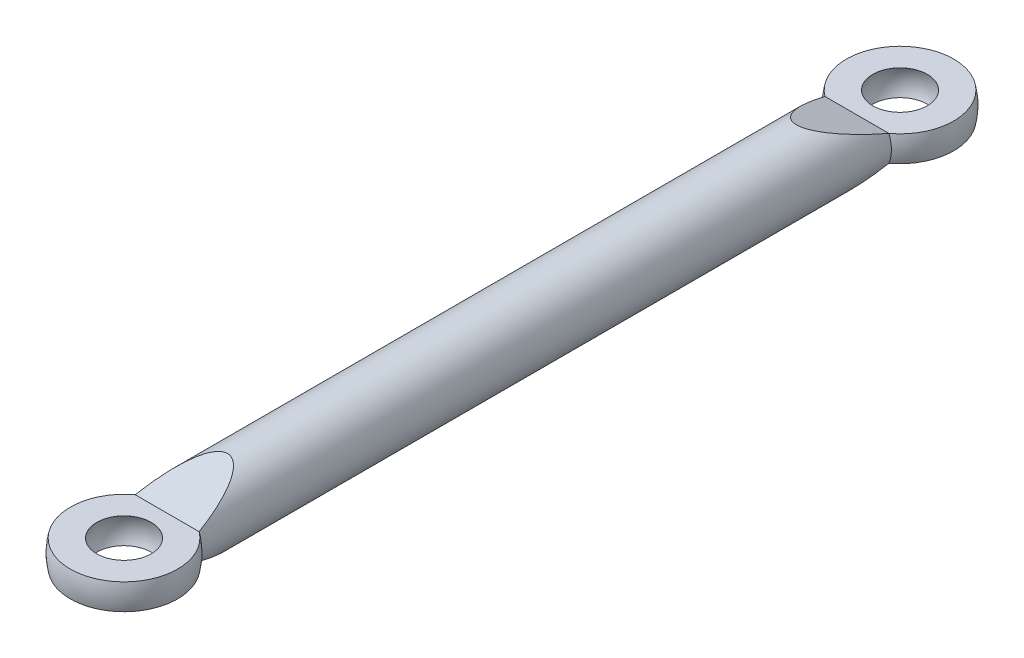
ISO-10303-21;
HEADER;
FILE_DESCRIPTION(('STEP AP214'),'2;1');
FILE_NAME('part.step','',(''),(''),'','','');
FILE_SCHEMA(('AUTOMOTIVE_DESIGN { 1 0 10303 214 1 1 1 1 }'));
ENDSEC;
DATA;
#1=APPLICATION_CONTEXT('core data for automotive mechanical design processes');
#2=APPLICATION_PROTOCOL_DEFINITION('international standard','automotive_design',2000,#1);
#3=PRODUCT_CONTEXT('',#1,'mechanical');
#4=PRODUCT('Part','Part','',(#3));
#5=PRODUCT_RELATED_PRODUCT_CATEGORY('part','',(#4));
#6=PRODUCT_DEFINITION_FORMATION('','',#4);
#7=PRODUCT_DEFINITION_CONTEXT('part definition',#1,'design');
#8=PRODUCT_DEFINITION('design','',#6,#7);
#9=PRODUCT_DEFINITION_SHAPE('','',#8);
#10=(LENGTH_UNIT() NAMED_UNIT(*) SI_UNIT(.MILLI.,.METRE.));
#11=(NAMED_UNIT(*) PLANE_ANGLE_UNIT() SI_UNIT($,.RADIAN.));
#12=(NAMED_UNIT(*) SI_UNIT($,.STERADIAN.) SOLID_ANGLE_UNIT());
#13=UNCERTAINTY_MEASURE_WITH_UNIT(LENGTH_MEASURE(1.E-05),#10,'distance_accuracy_value','');
#14=(GEOMETRIC_REPRESENTATION_CONTEXT(3) GLOBAL_UNCERTAINTY_ASSIGNED_CONTEXT((#13)) GLOBAL_UNIT_ASSIGNED_CONTEXT((#10,
#11,#12)) REPRESENTATION_CONTEXT('',''));
#15=CARTESIAN_POINT('',(0.,0.,0.));
#16=DIRECTION('',(0.,0.,1.));
#17=DIRECTION('',(1.,0.,0.));
#18=AXIS2_PLACEMENT_3D('',#15,#16,#17);
#19=CARTESIAN_POINT('',(0.,0.,40.));
#20=DIRECTION('',(0.,0.,-1.));
#21=DIRECTION('',(-1.,0.,0.));
#22=AXIS2_PLACEMENT_3D('',#19,#20,#21);
#23=CYLINDRICAL_SURFACE('',#22,4.);
#24=CARTESIAN_POINT('',(0.,0.,-40.));
#25=DIRECTION('',(0.,0.,1.));
#26=DIRECTION('',(1.,0.,0.));
#27=AXIS2_PLACEMENT_3D('',#24,#25,#26);
#28=CIRCLE('',#27,4.);
#29=CARTESIAN_POINT('',(-3.70809924354783,-1.5,-40.));
#30=VERTEX_POINT('',#29);
#31=CARTESIAN_POINT('',(-3.70809924354782,1.50000000000001,-40.));
#32=VERTEX_POINT('',#31);
#33=EDGE_CURVE('E83',#30,#32,#28,.F.);
#34=ORIENTED_EDGE('',*,*,#33,.F.);
#35=CARTESIAN_POINT('',(0.,0.,-44.2));
#36=DIRECTION('',(0.,0.941741911594837,0.336336396998157));
#37=DIRECTION('',(0.,0.336336396998157,-0.941741911594837));
#38=AXIS2_PLACEMENT_3D('',#35,#36,#37);
#39=ELLIPSE('',#38,11.8928549978548,4.);
#40=CARTESIAN_POINT('',(3.70809924354783,-1.5,-40.));
#41=VERTEX_POINT('',#40);
#42=EDGE_CURVE('E88',#30,#41,#39,.T.);
#43=ORIENTED_EDGE('',*,*,#42,.T.);
#44=CARTESIAN_POINT('',(3.70809924354783,1.50000000000001,-40.));
#45=VERTEX_POINT('',#44);
#46=EDGE_CURVE('E85',#45,#41,#28,.F.);
#47=ORIENTED_EDGE('',*,*,#46,.F.);
#48=CARTESIAN_POINT('',(0.,0.,-44.2000000000001));
#49=DIRECTION('',(0.,-0.941741911594838,0.336336396998155));
#50=DIRECTION('',(0.,-0.336336396998155,-0.941741911594838));
#51=AXIS2_PLACEMENT_3D('',#48,#49,#50);
#52=ELLIPSE('',#51,11.8928549978548,4.);
#53=EDGE_CURVE('E80',#45,#32,#52,.T.);
#54=ORIENTED_EDGE('',*,*,#53,.T.);
#55=EDGE_LOOP('',(#34,#43,#47,#54));
#56=FACE_BOUND('',#55,.T.);
#57=CARTESIAN_POINT('',(0.,0.,44.2));
#58=DIRECTION('',(0.,0.941741911594837,-0.336336396998156));
#59=DIRECTION('',(0.,-0.336336396998156,-0.941741911594838));
#60=AXIS2_PLACEMENT_3D('',#57,#58,#59);
#61=ELLIPSE('',#60,11.8928549978548,4.);
#62=CARTESIAN_POINT('',(3.70809924354784,-1.50000000000001,40.));
#63=VERTEX_POINT('',#62);
#64=CARTESIAN_POINT('',(-3.70809924354782,-1.50000000000001,40.));
#65=VERTEX_POINT('',#64);
#66=EDGE_CURVE('E89',#63,#65,#61,.T.);
#67=ORIENTED_EDGE('',*,*,#66,.T.);
#68=CARTESIAN_POINT('',(0.,0.,40.));
#69=DIRECTION('',(0.,0.,1.));
#70=DIRECTION('',(1.,0.,0.));
#71=AXIS2_PLACEMENT_3D('',#68,#69,#70);
#72=CIRCLE('',#71,4.);
#73=CARTESIAN_POINT('',(-3.70809924354782,1.5,40.));
#74=VERTEX_POINT('',#73);
#75=EDGE_CURVE('E11',#74,#65,#72,.T.);
#76=ORIENTED_EDGE('',*,*,#75,.F.);
#77=CARTESIAN_POINT('',(0.,0.,44.2));
#78=DIRECTION('',(0.,-0.941741911594837,-0.336336396998156));
#79=DIRECTION('',(0.,0.336336396998156,-0.941741911594837));
#80=AXIS2_PLACEMENT_3D('',#77,#78,#79);
#81=ELLIPSE('',#80,11.8928549978548,4.);
#82=CARTESIAN_POINT('',(3.70809924354784,1.5,40.));
#83=VERTEX_POINT('',#82);
#84=EDGE_CURVE('E103',#74,#83,#81,.T.);
#85=ORIENTED_EDGE('',*,*,#84,.T.);
#86=EDGE_CURVE('E44',#63,#83,#72,.T.);
#87=ORIENTED_EDGE('',*,*,#86,.F.);
#88=EDGE_LOOP('',(#67,#76,#85,#87));
#89=FACE_BOUND('',#88,.T.);
#90=ADVANCED_FACE('F36',(#56,#89),#23,.T.);
#91=CARTESIAN_POINT('',(0.,0.,-45.));
#92=DIRECTION('',(0.,0.,-1.));
#93=DIRECTION('',(-1.,0.,0.));
#94=AXIS2_PLACEMENT_3D('',#91,#92,#93);
#95=SPHERICAL_SURFACE('',#94,6.40312423743285);
#96=ORIENTED_EDGE('',*,*,#46,.T.);
#97=CARTESIAN_POINT('',(0.,-1.5,-45.));
#98=DIRECTION('',(0.,1.,0.));
#99=DIRECTION('',(0.,0.,1.));
#100=AXIS2_PLACEMENT_3D('',#97,#98,#99);
#101=CIRCLE('',#100,6.22494979899436);
#102=EDGE_CURVE('E101',#41,#30,#101,.T.);
#103=ORIENTED_EDGE('',*,*,#102,.T.);
#104=ORIENTED_EDGE('',*,*,#33,.T.);
#105=CARTESIAN_POINT('',(0.,1.50000000000001,-45.));
#106=DIRECTION('',(0.,-1.,0.));
#107=DIRECTION('',(0.,0.,-1.));
#108=AXIS2_PLACEMENT_3D('',#105,#106,#107);
#109=CIRCLE('',#108,6.22494979899436);
#110=EDGE_CURVE('E91',#32,#45,#109,.T.);
#111=ORIENTED_EDGE('',*,*,#110,.T.);
#112=EDGE_LOOP('',(#96,#103,#104,#111));
#113=FACE_BOUND('',#112,.T.);
#114=ADVANCED_FACE('F100',(#113),#95,.T.);
#115=CARTESIAN_POINT('',(0.,0.,45.));
#116=DIRECTION('',(0.,0.,-1.));
#117=DIRECTION('',(-1.,0.,0.));
#118=AXIS2_PLACEMENT_3D('',#115,#116,#117);
#119=SPHERICAL_SURFACE('',#118,6.40312423743285);
#120=CARTESIAN_POINT('',(0.,-1.50000000000001,45.));
#121=DIRECTION('',(0.,1.,0.));
#122=DIRECTION('',(0.,0.,1.));
#123=AXIS2_PLACEMENT_3D('',#120,#121,#122);
#124=CIRCLE('',#123,6.22494979899436);
#125=EDGE_CURVE('E119',#63,#65,#124,.F.);
#126=ORIENTED_EDGE('',*,*,#125,.F.);
#127=ORIENTED_EDGE('',*,*,#86,.T.);
#128=CARTESIAN_POINT('',(0.,1.5,45.));
#129=DIRECTION('',(0.,-1.,0.));
#130=DIRECTION('',(0.,0.,-1.));
#131=AXIS2_PLACEMENT_3D('',#128,#129,#130);
#132=CIRCLE('',#131,6.22494979899436);
#133=EDGE_CURVE('E110',#74,#83,#132,.F.);
#134=ORIENTED_EDGE('',*,*,#133,.F.);
#135=ORIENTED_EDGE('',*,*,#75,.T.);
#136=EDGE_LOOP('',(#126,#127,#134,#135));
#137=FACE_BOUND('',#136,.T.);
#138=ADVANCED_FACE('F137',(#137),#119,.T.);
#139=CARTESIAN_POINT('',(-6.40312423743285,4.,33.));
#140=DIRECTION('',(0.,-0.941741911594837,-0.336336396998156));
#141=DIRECTION('',(0.,0.336336396998156,-0.941741911594837));
#142=AXIS2_PLACEMENT_3D('',#139,#140,#141);
#143=PLANE('',#142);
#144=ORIENTED_EDGE('',*,*,#84,.F.);
#145=DIRECTION('',(1.,0.,0.));
#146=VECTOR('',#145,1.);
#147=CARTESIAN_POINT('',(-6.40312423743285,1.5,40.));
#148=LINE('',#147,#146);
#149=EDGE_CURVE('E111',#74,#83,#148,.T.);
#150=ORIENTED_EDGE('',*,*,#149,.T.);
#151=EDGE_LOOP('',(#144,#150));
#152=FACE_BOUND('',#151,.T.);
#153=ADVANCED_FACE('F134',(#152),#143,.F.);
#154=CARTESIAN_POINT('',(-6.40312423743285,1.5,40.));
#155=DIRECTION('',(0.,-1.,0.));
#156=DIRECTION('',(0.,0.,-1.));
#157=AXIS2_PLACEMENT_3D('',#154,#155,#156);
#158=PLANE('',#157);
#159=ORIENTED_EDGE('',*,*,#133,.T.);
#160=ORIENTED_EDGE('',*,*,#149,.F.);
#161=EDGE_LOOP('',(#159,#160));
#162=FACE_BOUND('',#161,.T.);
#163=CARTESIAN_POINT('',(0.,1.5,45.));
#164=DIRECTION('',(0.,-1.,0.));
#165=DIRECTION('',(0.,0.,-1.));
#166=AXIS2_PLACEMENT_3D('',#163,#164,#165);
#167=CIRCLE('',#166,3.16227766016838);
#168=CARTESIAN_POINT('',(0.,1.5,41.8377223398316));
#169=VERTEX_POINT('',#168);
#170=EDGE_CURVE('E107',#169,#169,#167,.F.);
#171=ORIENTED_EDGE('',*,*,#170,.F.);
#172=EDGE_LOOP('',(#171));
#173=FACE_BOUND('',#172,.T.);
#174=ADVANCED_FACE('F174',(#162,#173),#158,.F.);
#175=CARTESIAN_POINT('',(0.,0.,45.));
#176=DIRECTION('',(0.,0.,-1.));
#177=DIRECTION('',(-1.,0.,0.));
#178=AXIS2_PLACEMENT_3D('',#175,#176,#177);
#179=SPHERICAL_SURFACE('',#178,3.5);
#180=CARTESIAN_POINT('',(0.,0.,45.));
#181=DIRECTION('',(0.,1.,0.));
#182=DIRECTION('',(0.,0.,1.));
#183=AXIS2_PLACEMENT_3D('',#180,#181,#182);
#184=SPHERICAL_SURFACE('',#183,3.5);
#185=CARTESIAN_POINT('',(0.,-1.50000000000001,45.));
#186=DIRECTION('',(0.,1.,0.));
#187=DIRECTION('',(0.,0.,1.));
#188=AXIS2_PLACEMENT_3D('',#185,#186,#187);
#189=CIRCLE('',#188,3.16227766016837);
#190=CARTESIAN_POINT('',(0.,-1.50000000000001,48.1622776601684));
#191=VERTEX_POINT('',#190);
#192=EDGE_CURVE('E39',#191,#191,#189,.F.);
#193=ORIENTED_EDGE('',*,*,#192,.T.);
#194=EDGE_LOOP('',(#193));
#195=FACE_BOUND('',#194,.T.);
#196=ORIENTED_EDGE('',*,*,#170,.T.);
#197=EDGE_LOOP('',(#196));
#198=FACE_BOUND('',#197,.T.);
#199=ADVANCED_FACE('F172',(#195,#198),#184,.F.);
#200=CARTESIAN_POINT('',(-6.40312423743285,4.,-33.));
#201=DIRECTION('',(0.,-0.941741911594838,0.336336396998155));
#202=DIRECTION('',(0.,-0.336336396998155,-0.941741911594838));
#203=AXIS2_PLACEMENT_3D('',#200,#201,#202);
#204=PLANE('',#203);
#205=DIRECTION('',(1.,0.,0.));
#206=VECTOR('',#205,1.);
#207=CARTESIAN_POINT('',(-6.40312423743285,1.50000000000001,-40.));
#208=LINE('',#207,#206);
#209=EDGE_CURVE('E51',#32,#45,#208,.T.);
#210=ORIENTED_EDGE('',*,*,#209,.F.);
#211=ORIENTED_EDGE('',*,*,#53,.F.);
#212=EDGE_LOOP('',(#210,#211));
#213=FACE_BOUND('',#212,.T.);
#214=ADVANCED_FACE('F97',(#213),#204,.F.);
#215=CARTESIAN_POINT('',(-6.40312423743285,1.50000000000001,-40.));
#216=DIRECTION('',(0.,-1.,0.));
#217=DIRECTION('',(0.,0.,-1.));
#218=AXIS2_PLACEMENT_3D('',#215,#216,#217);
#219=PLANE('',#218);
#220=CARTESIAN_POINT('',(0.,1.50000000000001,-45.));
#221=DIRECTION('',(0.,-1.,0.));
#222=DIRECTION('',(0.,0.,-1.));
#223=AXIS2_PLACEMENT_3D('',#220,#221,#222);
#224=CIRCLE('',#223,3.16227766016837);
#225=CARTESIAN_POINT('',(0.,1.50000000000001,-48.1622776601684));
#226=VERTEX_POINT('',#225);
#227=EDGE_CURVE('E95',#226,#226,#224,.T.);
#228=ORIENTED_EDGE('',*,*,#227,.T.);
#229=EDGE_LOOP('',(#228));
#230=FACE_BOUND('',#229,.T.);
#231=ORIENTED_EDGE('',*,*,#209,.T.);
#232=ORIENTED_EDGE('',*,*,#110,.F.);
#233=EDGE_LOOP('',(#231,#232));
#234=FACE_BOUND('',#233,.T.);
#235=ADVANCED_FACE('F92',(#230,#234),#219,.F.);
#236=CARTESIAN_POINT('',(-6.40312423743285,-4.00000000000001,-33.));
#237=DIRECTION('',(0.,0.941741911594837,0.336336396998157));
#238=DIRECTION('',(0.,-0.336336396998157,0.941741911594837));
#239=AXIS2_PLACEMENT_3D('',#236,#237,#238);
#240=PLANE('',#239);
#241=DIRECTION('',(1.,0.,0.));
#242=VECTOR('',#241,1.);
#243=CARTESIAN_POINT('',(-6.40312423743285,-1.5,-40.));
#244=LINE('',#243,#242);
#245=EDGE_CURVE('E58',#30,#41,#244,.T.);
#246=ORIENTED_EDGE('',*,*,#245,.T.);
#247=ORIENTED_EDGE('',*,*,#42,.F.);
#248=EDGE_LOOP('',(#246,#247));
#249=FACE_BOUND('',#248,.T.);
#250=ADVANCED_FACE('F148',(#249),#240,.F.);
#251=CARTESIAN_POINT('',(-6.40312423743285,-1.5,-40.));
#252=DIRECTION('',(0.,1.,0.));
#253=DIRECTION('',(0.,0.,1.));
#254=AXIS2_PLACEMENT_3D('',#251,#252,#253);
#255=PLANE('',#254);
#256=CARTESIAN_POINT('',(0.,-1.5,-45.));
#257=DIRECTION('',(0.,1.,0.));
#258=DIRECTION('',(0.,0.,1.));
#259=AXIS2_PLACEMENT_3D('',#256,#257,#258);
#260=CIRCLE('',#259,3.16227766016838);
#261=CARTESIAN_POINT('',(0.,-1.5,-41.8377223398316));
#262=VERTEX_POINT('',#261);
#263=EDGE_CURVE('E94',#262,#262,#260,.T.);
#264=ORIENTED_EDGE('',*,*,#263,.T.);
#265=EDGE_LOOP('',(#264));
#266=FACE_BOUND('',#265,.T.);
#267=ORIENTED_EDGE('',*,*,#245,.F.);
#268=ORIENTED_EDGE('',*,*,#102,.F.);
#269=EDGE_LOOP('',(#267,#268));
#270=FACE_BOUND('',#269,.T.);
#271=ADVANCED_FACE('F149',(#266,#270),#255,.F.);
#272=CARTESIAN_POINT('',(-6.40312423743285,-4.00000000000001,33.));
#273=DIRECTION('',(0.,0.941741911594837,-0.336336396998156));
#274=DIRECTION('',(0.,0.336336396998156,0.941741911594838));
#275=AXIS2_PLACEMENT_3D('',#272,#273,#274);
#276=PLANE('',#275);
#277=ORIENTED_EDGE('',*,*,#66,.F.);
#278=DIRECTION('',(1.,0.,0.));
#279=VECTOR('',#278,1.);
#280=CARTESIAN_POINT('',(-6.40312423743285,-1.50000000000001,40.));
#281=LINE('',#280,#279);
#282=EDGE_CURVE('E113',#65,#63,#281,.T.);
#283=ORIENTED_EDGE('',*,*,#282,.F.);
#284=EDGE_LOOP('',(#277,#283));
#285=FACE_BOUND('',#284,.T.);
#286=ADVANCED_FACE('F144',(#285),#276,.F.);
#287=CARTESIAN_POINT('',(-6.40312423743285,-1.50000000000001,40.));
#288=DIRECTION('',(0.,1.,0.));
#289=DIRECTION('',(0.,0.,1.));
#290=AXIS2_PLACEMENT_3D('',#287,#288,#289);
#291=PLANE('',#290);
#292=ORIENTED_EDGE('',*,*,#125,.T.);
#293=ORIENTED_EDGE('',*,*,#282,.T.);
#294=EDGE_LOOP('',(#292,#293));
#295=FACE_BOUND('',#294,.T.);
#296=ORIENTED_EDGE('',*,*,#192,.F.);
#297=EDGE_LOOP('',(#296));
#298=FACE_BOUND('',#297,.T.);
#299=ADVANCED_FACE('F140',(#295,#298),#291,.F.);
#300=CARTESIAN_POINT('',(0.,0.,-45.));
#301=DIRECTION('',(0.,0.,-1.));
#302=DIRECTION('',(-1.,0.,0.));
#303=AXIS2_PLACEMENT_3D('',#300,#301,#302);
#304=SPHERICAL_SURFACE('',#303,3.5);
#305=CARTESIAN_POINT('',(0.,0.,-45.));
#306=DIRECTION('',(0.,1.,0.));
#307=DIRECTION('',(0.,0.,1.));
#308=AXIS2_PLACEMENT_3D('',#305,#306,#307);
#309=SPHERICAL_SURFACE('',#308,3.5);
#310=ORIENTED_EDGE('',*,*,#263,.F.);
#311=EDGE_LOOP('',(#310));
#312=FACE_BOUND('',#311,.T.);
#313=ORIENTED_EDGE('',*,*,#227,.F.);
#314=EDGE_LOOP('',(#313));
#315=FACE_BOUND('',#314,.T.);
#316=ADVANCED_FACE('F168',(#312,#315),#309,.F.);
#317=CLOSED_SHELL('',(#90,#114,#138,#153,#174,#199,#214,#235,#250,#271,#286,#299,#316));
#318=MANIFOLD_SOLID_BREP('B2',#317);
#319=ADVANCED_BREP_SHAPE_REPRESENTATION('',(#18,#318),#14);
#320=SHAPE_DEFINITION_REPRESENTATION(#9,#319);
ENDSEC;
END-ISO-10303-21;
